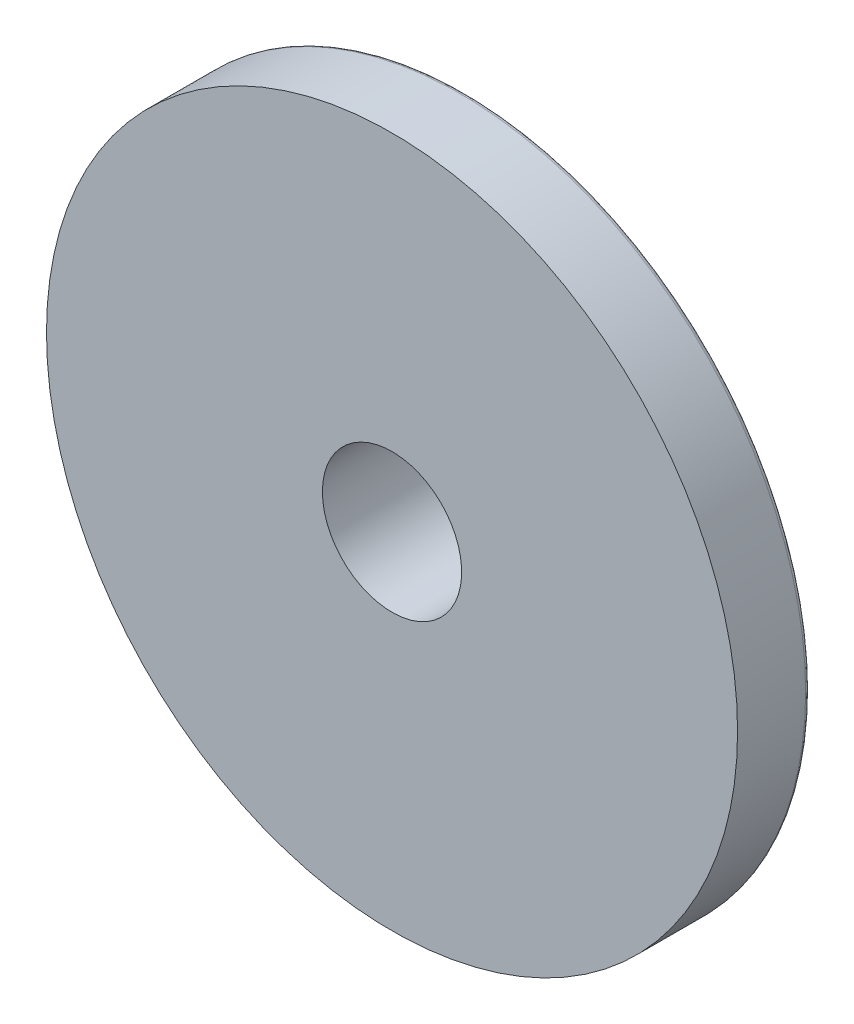
ISO-10303-21;
HEADER;
FILE_DESCRIPTION(('STEP AP214'),'2;1');
FILE_NAME('part.step','',(''),(''),'','','');
FILE_SCHEMA(('AUTOMOTIVE_DESIGN { 1 0 10303 214 1 1 1 1 }'));
ENDSEC;
DATA;
#1=APPLICATION_CONTEXT('core data for automotive mechanical design processes');
#2=APPLICATION_PROTOCOL_DEFINITION('international standard','automotive_design',2000,#1);
#3=PRODUCT_CONTEXT('',#1,'mechanical');
#4=PRODUCT('Part','Part','',(#3));
#5=PRODUCT_RELATED_PRODUCT_CATEGORY('part','',(#4));
#6=PRODUCT_DEFINITION_FORMATION('','',#4);
#7=PRODUCT_DEFINITION_CONTEXT('part definition',#1,'design');
#8=PRODUCT_DEFINITION('design','',#6,#7);
#9=PRODUCT_DEFINITION_SHAPE('','',#8);
#10=(LENGTH_UNIT() NAMED_UNIT(*) SI_UNIT(.MILLI.,.METRE.));
#11=(NAMED_UNIT(*) PLANE_ANGLE_UNIT() SI_UNIT($,.RADIAN.));
#12=(NAMED_UNIT(*) SI_UNIT($,.STERADIAN.) SOLID_ANGLE_UNIT());
#13=UNCERTAINTY_MEASURE_WITH_UNIT(LENGTH_MEASURE(1.E-05),#10,'distance_accuracy_value','');
#14=(GEOMETRIC_REPRESENTATION_CONTEXT(3) GLOBAL_UNCERTAINTY_ASSIGNED_CONTEXT((#13)) GLOBAL_UNIT_ASSIGNED_CONTEXT((#10,
#11,#12)) REPRESENTATION_CONTEXT('',''));
#15=CARTESIAN_POINT('',(0.,0.,0.));
#16=DIRECTION('',(0.,0.,1.));
#17=DIRECTION('',(1.,0.,0.));
#18=AXIS2_PLACEMENT_3D('',#15,#16,#17);
#19=CARTESIAN_POINT('',(38.481,-19.05,-50.8));
#20=DIRECTION('',(0.,0.,-1.));
#21=DIRECTION('',(-1.,0.,0.));
#22=AXIS2_PLACEMENT_3D('',#19,#20,#21);
#23=CYLINDRICAL_SURFACE('',#22,7.747);
#24=CARTESIAN_POINT('',(38.481,-19.05,-7.9375));
#25=DIRECTION('',(0.,0.,-1.));
#26=DIRECTION('',(-1.,0.,0.));
#27=AXIS2_PLACEMENT_3D('',#24,#25,#26);
#28=CIRCLE('',#27,7.747);
#29=CARTESIAN_POINT('',(30.734,-19.05,-7.9375));
#30=VERTEX_POINT('',#29);
#31=EDGE_CURVE('E10',#30,#30,#28,.T.);
#32=ORIENTED_EDGE('',*,*,#31,.F.);
#33=EDGE_LOOP('',(#32));
#34=FACE_BOUND('',#33,.T.);
#35=CARTESIAN_POINT('',(38.481,-19.05,-20.44446));
#36=DIRECTION('',(0.,0.,-1.));
#37=DIRECTION('',(-1.,0.,0.));
#38=AXIS2_PLACEMENT_3D('',#35,#36,#37);
#39=CIRCLE('',#38,7.747);
#40=CARTESIAN_POINT('',(30.734,-19.05,-20.44446));
#41=VERTEX_POINT('',#40);
#42=EDGE_CURVE('E63',#41,#41,#39,.T.);
#43=ORIENTED_EDGE('',*,*,#42,.T.);
#44=EDGE_LOOP('',(#43));
#45=FACE_BOUND('',#44,.T.);
#46=ADVANCED_FACE('F41',(#34,#45),#23,.F.);
#47=CARTESIAN_POINT('',(46.228,-19.05,-7.9375));
#48=DIRECTION('',(0.,0.,-1.));
#49=DIRECTION('',(-1.,0.,0.));
#50=AXIS2_PLACEMENT_3D('',#47,#48,#49);
#51=PLANE('',#50);
#52=CARTESIAN_POINT('',(38.481,-19.05,-7.9375));
#53=DIRECTION('',(0.,0.,-1.));
#54=DIRECTION('',(-1.,0.,0.));
#55=AXIS2_PLACEMENT_3D('',#52,#53,#54);
#56=CIRCLE('',#55,38.44925);
#57=CARTESIAN_POINT('',(0.0317499999999971,-19.05,-7.9375));
#58=VERTEX_POINT('',#57);
#59=EDGE_CURVE('E47',#58,#58,#56,.T.);
#60=ORIENTED_EDGE('',*,*,#59,.F.);
#61=EDGE_LOOP('',(#60));
#62=FACE_BOUND('',#61,.T.);
#63=ORIENTED_EDGE('',*,*,#31,.T.);
#64=EDGE_LOOP('',(#63));
#65=FACE_BOUND('',#64,.T.);
#66=ADVANCED_FACE('F88',(#62,#65),#51,.F.);
#67=CARTESIAN_POINT('',(38.481,-19.05,-50.8));
#68=DIRECTION('',(0.,0.,-1.));
#69=DIRECTION('',(-1.,0.,0.));
#70=AXIS2_PLACEMENT_3D('',#67,#68,#69);
#71=CYLINDRICAL_SURFACE('',#70,38.44925);
#72=CARTESIAN_POINT('',(38.481,-19.05,-15.50924));
#73=DIRECTION('',(0.,0.,-1.));
#74=DIRECTION('',(-1.,0.,0.));
#75=AXIS2_PLACEMENT_3D('',#72,#73,#74);
#76=CIRCLE('',#75,38.44925);
#77=CARTESIAN_POINT('',(0.0317499999999971,-19.05,-15.50924));
#78=VERTEX_POINT('',#77);
#79=EDGE_CURVE('E51',#78,#78,#76,.T.);
#80=ORIENTED_EDGE('',*,*,#79,.F.);
#81=EDGE_LOOP('',(#80));
#82=FACE_BOUND('',#81,.T.);
#83=ORIENTED_EDGE('',*,*,#59,.T.);
#84=EDGE_LOOP('',(#83));
#85=FACE_BOUND('',#84,.T.);
#86=ADVANCED_FACE('F83',(#82,#85),#71,.T.);
#87=CARTESIAN_POINT('',(38.481,-19.05,-15.508417217605));
#88=DIRECTION('',(0.,0.,-1.));
#89=DIRECTION('',(-1.,0.,0.));
#90=AXIS2_PLACEMENT_3D('',#87,#88,#89);
#91=TOROIDAL_SURFACE('',#90,37.9386961176364,0.5105545453401);
#92=CARTESIAN_POINT('',(38.481,-19.05,-15.9916962579279));
#93=DIRECTION('',(0.,0.,-1.));
#94=DIRECTION('',(-1.,0.,0.));
#95=AXIS2_PLACEMENT_3D('',#92,#93,#94);
#96=CIRCLE('',#95,38.1033391039798);
#97=CARTESIAN_POINT('',(0.37766089602019,-19.05,-15.9916962579279));
#98=VERTEX_POINT('',#97);
#99=EDGE_CURVE('E55',#98,#98,#96,.T.);
#100=ORIENTED_EDGE('',*,*,#99,.F.);
#101=EDGE_LOOP('',(#100));
#102=FACE_BOUND('',#101,.T.);
#103=ORIENTED_EDGE('',*,*,#79,.T.);
#104=EDGE_LOOP('',(#103));
#105=FACE_BOUND('',#104,.T.);
#106=ADVANCED_FACE('F77',(#102,#105),#91,.T.);
#107=CARTESIAN_POINT('',(38.481,-19.05,74.363580000001));
#108=DIRECTION('',(0.,0.,-1.));
#109=DIRECTION('',(-1.,0.,0.));
#110=AXIS2_PLACEMENT_3D('',#107,#108,#109);
#111=DEGENERATE_TOROIDAL_SURFACE('',#110,7.74699999999973,95.318326000001,.T.);
#112=CARTESIAN_POINT('',(38.481,-19.05,-20.95337772262));
#113=DIRECTION('',(0.,0.,-1.));
#114=DIRECTION('',(-1.,0.,0.));
#115=AXIS2_PLACEMENT_3D('',#112,#113,#114);
#116=CIRCLE('',#115,8.25772688057986);
#117=CARTESIAN_POINT('',(30.2232731194201,-19.05,-20.95337772262));
#118=VERTEX_POINT('',#117);
#119=EDGE_CURVE('E60',#118,#118,#116,.T.);
#120=ORIENTED_EDGE('',*,*,#119,.F.);
#121=EDGE_LOOP('',(#120));
#122=FACE_BOUND('',#121,.T.);
#123=ORIENTED_EDGE('',*,*,#99,.T.);
#124=EDGE_LOOP('',(#123));
#125=FACE_BOUND('',#124,.T.);
#126=ADVANCED_FACE('F71',(#122,#125),#111,.T.);
#127=CARTESIAN_POINT('',(38.481,-19.05,-20.4460290189909));
#128=DIRECTION('',(0.,0.,-1.));
#129=DIRECTION('',(-1.,0.,0.));
#130=AXIS2_PLACEMENT_3D('',#127,#128,#129);
#131=TOROIDAL_SURFACE('',#130,8.25435746590422,0.507359892018816);
#132=ORIENTED_EDGE('',*,*,#42,.F.);
#133=EDGE_LOOP('',(#132));
#134=FACE_BOUND('',#133,.T.);
#135=ORIENTED_EDGE('',*,*,#119,.T.);
#136=EDGE_LOOP('',(#135));
#137=FACE_BOUND('',#136,.T.);
#138=ADVANCED_FACE('F68',(#134,#137),#131,.T.);
#139=CLOSED_SHELL('',(#46,#66,#86,#106,#126,#138));
#140=MANIFOLD_SOLID_BREP('B2',#139);
#141=ADVANCED_BREP_SHAPE_REPRESENTATION('',(#18,#140),#14);
#142=SHAPE_DEFINITION_REPRESENTATION(#9,#141);
ENDSEC;
END-ISO-10303-21;
